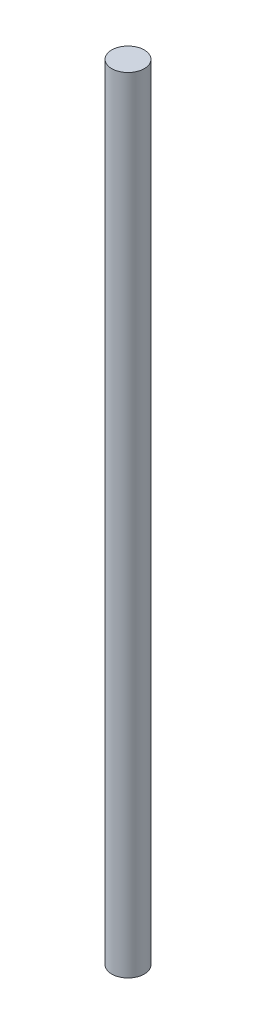
ISO-10303-21;
HEADER;
FILE_DESCRIPTION(('STEP AP214'),'2;1');
FILE_NAME('part.step','',(''),(''),'','','');
FILE_SCHEMA(('AUTOMOTIVE_DESIGN { 1 0 10303 214 1 1 1 1 }'));
ENDSEC;
DATA;
#1=APPLICATION_CONTEXT('core data for automotive mechanical design processes');
#2=APPLICATION_PROTOCOL_DEFINITION('international standard','automotive_design',2000,#1);
#3=PRODUCT_CONTEXT('',#1,'mechanical');
#4=PRODUCT('Part','Part','',(#3));
#5=PRODUCT_RELATED_PRODUCT_CATEGORY('part','',(#4));
#6=PRODUCT_DEFINITION_FORMATION('','',#4);
#7=PRODUCT_DEFINITION_CONTEXT('part definition',#1,'design');
#8=PRODUCT_DEFINITION('design','',#6,#7);
#9=PRODUCT_DEFINITION_SHAPE('','',#8);
#10=(LENGTH_UNIT() NAMED_UNIT(*) SI_UNIT(.MILLI.,.METRE.));
#11=(NAMED_UNIT(*) PLANE_ANGLE_UNIT() SI_UNIT($,.RADIAN.));
#12=(NAMED_UNIT(*) SI_UNIT($,.STERADIAN.) SOLID_ANGLE_UNIT());
#13=UNCERTAINTY_MEASURE_WITH_UNIT(LENGTH_MEASURE(1.E-05),#10,'distance_accuracy_value','');
#14=(GEOMETRIC_REPRESENTATION_CONTEXT(3) GLOBAL_UNCERTAINTY_ASSIGNED_CONTEXT((#13)) GLOBAL_UNIT_ASSIGNED_CONTEXT((#10,
#11,#12)) REPRESENTATION_CONTEXT('',''));
#15=CARTESIAN_POINT('',(0.,0.,0.));
#16=DIRECTION('',(0.,0.,1.));
#17=DIRECTION('',(1.,0.,0.));
#18=AXIS2_PLACEMENT_3D('',#15,#16,#17);
#19=CARTESIAN_POINT('',(0.,299.5,0.));
#20=DIRECTION('',(0.,-1.,0.));
#21=DIRECTION('',(0.,0.,-1.));
#22=AXIS2_PLACEMENT_3D('',#19,#20,#21);
#23=CYLINDRICAL_SURFACE('',#22,6.2);
#24=CARTESIAN_POINT('',(0.,299.5,0.));
#25=DIRECTION('',(0.,1.,0.));
#26=DIRECTION('',(0.,0.,1.));
#27=AXIS2_PLACEMENT_3D('',#24,#25,#26);
#28=CIRCLE('',#27,6.2);
#29=CARTESIAN_POINT('',(0.,299.5,6.2));
#30=VERTEX_POINT('',#29);
#31=EDGE_CURVE('E10',#30,#30,#28,.T.);
#32=ORIENTED_EDGE('',*,*,#31,.F.);
#33=EDGE_LOOP('',(#32));
#34=FACE_BOUND('',#33,.T.);
#35=CARTESIAN_POINT('',(0.,0.,0.));
#36=DIRECTION('',(0.,1.,0.));
#37=DIRECTION('',(0.,0.,1.));
#38=AXIS2_PLACEMENT_3D('',#35,#36,#37);
#39=CIRCLE('',#38,6.2);
#40=CARTESIAN_POINT('',(0.,0.,6.2));
#41=VERTEX_POINT('',#40);
#42=EDGE_CURVE('E35',#41,#41,#39,.T.);
#43=ORIENTED_EDGE('',*,*,#42,.T.);
#44=EDGE_LOOP('',(#43));
#45=FACE_BOUND('',#44,.T.);
#46=ADVANCED_FACE('F32',(#34,#45),#23,.T.);
#47=CARTESIAN_POINT('',(0.,299.5,0.));
#48=DIRECTION('',(0.,1.,0.));
#49=DIRECTION('',(0.,0.,1.));
#50=AXIS2_PLACEMENT_3D('',#47,#48,#49);
#51=PLANE('',#50);
#52=ORIENTED_EDGE('',*,*,#31,.T.);
#53=EDGE_LOOP('',(#52));
#54=FACE_BOUND('',#53,.T.);
#55=ADVANCED_FACE('F47',(#54),#51,.T.);
#56=CARTESIAN_POINT('',(0.,0.,0.));
#57=DIRECTION('',(0.,1.,0.));
#58=DIRECTION('',(0.,0.,1.));
#59=AXIS2_PLACEMENT_3D('',#56,#57,#58);
#60=PLANE('',#59);
#61=ORIENTED_EDGE('',*,*,#42,.F.);
#62=EDGE_LOOP('',(#61));
#63=FACE_BOUND('',#62,.T.);
#64=ADVANCED_FACE('F45',(#63),#60,.F.);
#65=CLOSED_SHELL('',(#46,#55,#64));
#66=MANIFOLD_SOLID_BREP('B2',#65);
#67=ADVANCED_BREP_SHAPE_REPRESENTATION('',(#18,#66),#14);
#68=SHAPE_DEFINITION_REPRESENTATION(#9,#67);
ENDSEC;
END-ISO-10303-21;
